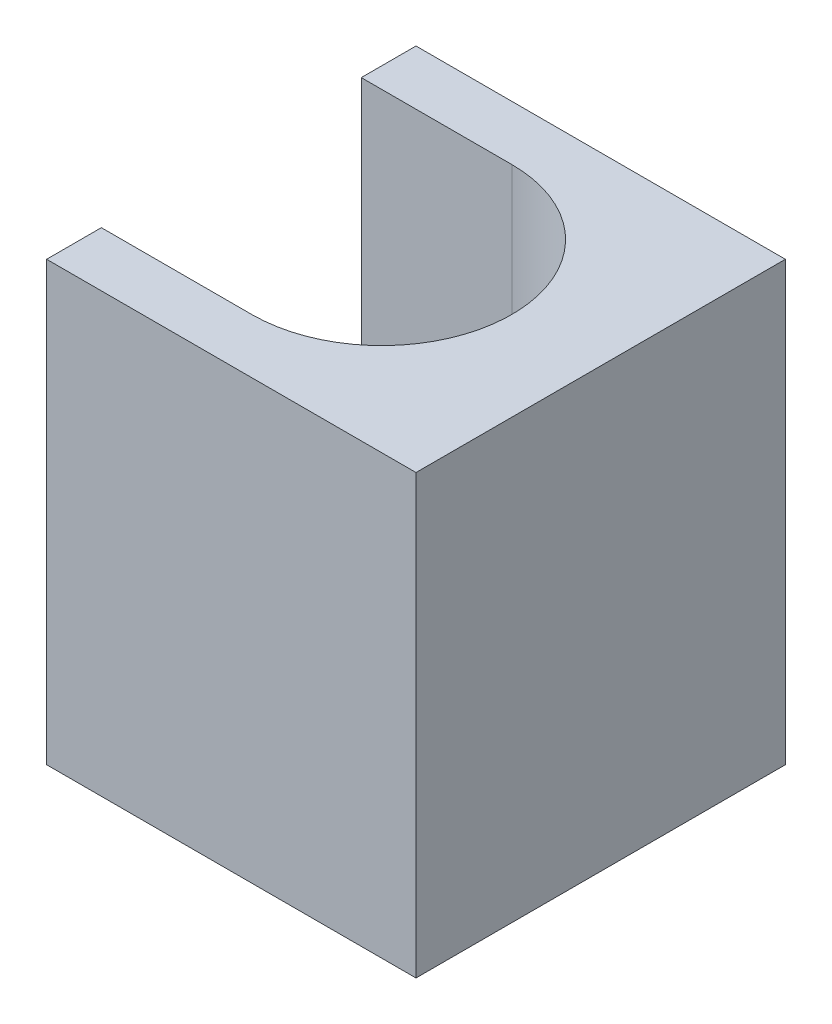
ISO-10303-21;
HEADER;
FILE_DESCRIPTION(('STEP AP214'),'2;1');
FILE_NAME('part.step','',(''),(''),'','','');
FILE_SCHEMA(('AUTOMOTIVE_DESIGN { 1 0 10303 214 1 1 1 1 }'));
ENDSEC;
DATA;
#1=APPLICATION_CONTEXT('core data for automotive mechanical design processes');
#2=APPLICATION_PROTOCOL_DEFINITION('international standard','automotive_design',2000,#1);
#3=PRODUCT_CONTEXT('',#1,'mechanical');
#4=PRODUCT('Part','Part','',(#3));
#5=PRODUCT_RELATED_PRODUCT_CATEGORY('part','',(#4));
#6=PRODUCT_DEFINITION_FORMATION('','',#4);
#7=PRODUCT_DEFINITION_CONTEXT('part definition',#1,'design');
#8=PRODUCT_DEFINITION('design','',#6,#7);
#9=PRODUCT_DEFINITION_SHAPE('','',#8);
#10=(LENGTH_UNIT() NAMED_UNIT(*) SI_UNIT(.MILLI.,.METRE.));
#11=(NAMED_UNIT(*) PLANE_ANGLE_UNIT() SI_UNIT($,.RADIAN.));
#12=(NAMED_UNIT(*) SI_UNIT($,.STERADIAN.) SOLID_ANGLE_UNIT());
#13=UNCERTAINTY_MEASURE_WITH_UNIT(LENGTH_MEASURE(1.E-05),#10,'distance_accuracy_value','');
#14=(GEOMETRIC_REPRESENTATION_CONTEXT(3) GLOBAL_UNCERTAINTY_ASSIGNED_CONTEXT((#13)) GLOBAL_UNIT_ASSIGNED_CONTEXT((#10,
#11,#12)) REPRESENTATION_CONTEXT('',''));
#15=CARTESIAN_POINT('',(0.,0.,0.));
#16=DIRECTION('',(0.,0.,1.));
#17=DIRECTION('',(1.,0.,0.));
#18=AXIS2_PLACEMENT_3D('',#15,#16,#17);
#19=CARTESIAN_POINT('',(5.5,16.,-4.75));
#20=DIRECTION('',(0.,-1.,0.));
#21=DIRECTION('',(0.,0.,-1.));
#22=AXIS2_PLACEMENT_3D('',#19,#20,#21);
#23=CYLINDRICAL_SURFACE('',#22,3.5);
#24=CARTESIAN_POINT('',(5.5,0.,-4.75));
#25=DIRECTION('',(0.,1.,0.));
#26=DIRECTION('',(0.,0.,1.));
#27=AXIS2_PLACEMENT_3D('',#24,#25,#26);
#28=CIRCLE('',#27,3.5);
#29=CARTESIAN_POINT('',(5.5,0.,-1.25));
#30=VERTEX_POINT('',#29);
#31=EDGE_CURVE('E194',#30,#30,#28,.T.);
#32=ORIENTED_EDGE('',*,*,#31,.F.);
#33=EDGE_LOOP('',(#32));
#34=FACE_BOUND('',#33,.T.);
#35=CARTESIAN_POINT('',(5.5,2.,-4.75));
#36=DIRECTION('',(0.,1.,0.));
#37=DIRECTION('',(0.,0.,1.));
#38=AXIS2_PLACEMENT_3D('',#35,#36,#37);
#39=CIRCLE('',#38,3.5);
#40=CARTESIAN_POINT('',(5.5,2.,-1.25));
#41=VERTEX_POINT('',#40);
#42=EDGE_CURVE('E140',#41,#41,#39,.T.);
#43=ORIENTED_EDGE('',*,*,#42,.T.);
#44=EDGE_LOOP('',(#43));
#45=FACE_BOUND('',#44,.T.);
#46=ADVANCED_FACE('F35',(#34,#45),#23,.F.);
#47=CARTESIAN_POINT('',(0.,16.,0.));
#48=DIRECTION('',(-1.,0.,0.));
#49=DIRECTION('',(0.,0.,1.));
#50=AXIS2_PLACEMENT_3D('',#47,#48,#49);
#51=PLANE('',#50);
#52=DIRECTION('',(0.,-1.,0.));
#53=VECTOR('',#52,1.);
#54=CARTESIAN_POINT('',(0.,6.,-9.5));
#55=LINE('',#54,#53);
#56=CARTESIAN_POINT('',(0.,16.,-9.5));
#57=VERTEX_POINT('',#56);
#58=CARTESIAN_POINT('',(0.,2.,-9.5));
#59=VERTEX_POINT('',#58);
#60=EDGE_CURVE('E162',#57,#59,#55,.T.);
#61=ORIENTED_EDGE('',*,*,#60,.F.);
#62=DIRECTION('',(0.,0.,-1.));
#63=VECTOR('',#62,1.);
#64=CARTESIAN_POINT('',(0.,16.,0.));
#65=LINE('',#64,#63);
#66=CARTESIAN_POINT('',(0.,16.,-11.5));
#67=VERTEX_POINT('',#66);
#68=EDGE_CURVE('E133',#57,#67,#65,.T.);
#69=ORIENTED_EDGE('',*,*,#68,.T.);
#70=DIRECTION('',(0.,-1.,0.));
#71=VECTOR('',#70,1.);
#72=CARTESIAN_POINT('',(0.,16.,-11.5));
#73=LINE('',#72,#71);
#74=CARTESIAN_POINT('',(0.,0.,-11.5));
#75=VERTEX_POINT('',#74);
#76=EDGE_CURVE('E182',#67,#75,#73,.T.);
#77=ORIENTED_EDGE('',*,*,#76,.T.);
#78=DIRECTION('',(0.,0.,-1.));
#79=VECTOR('',#78,1.);
#80=CARTESIAN_POINT('',(0.,0.,0.));
#81=LINE('',#80,#79);
#82=CARTESIAN_POINT('',(0.,0.,2.));
#83=VERTEX_POINT('',#82);
#84=EDGE_CURVE('E169',#83,#75,#81,.T.);
#85=ORIENTED_EDGE('',*,*,#84,.F.);
#86=DIRECTION('',(0.,-1.,0.));
#87=VECTOR('',#86,1.);
#88=CARTESIAN_POINT('',(0.,16.,2.));
#89=LINE('',#88,#87);
#90=CARTESIAN_POINT('',(0.,16.,2.));
#91=VERTEX_POINT('',#90);
#92=EDGE_CURVE('E11',#91,#83,#89,.T.);
#93=ORIENTED_EDGE('',*,*,#92,.F.);
#94=CARTESIAN_POINT('',(0.,16.,0.));
#95=VERTEX_POINT('',#94);
#96=EDGE_CURVE('E170',#91,#95,#65,.T.);
#97=ORIENTED_EDGE('',*,*,#96,.T.);
#98=DIRECTION('',(0.,-1.,0.));
#99=VECTOR('',#98,1.);
#100=CARTESIAN_POINT('',(0.,6.,0.));
#101=LINE('',#100,#99);
#102=CARTESIAN_POINT('',(0.,2.,0.));
#103=VERTEX_POINT('',#102);
#104=EDGE_CURVE('E149',#95,#103,#101,.T.);
#105=ORIENTED_EDGE('',*,*,#104,.T.);
#106=DIRECTION('',(0.,0.,-1.));
#107=VECTOR('',#106,1.);
#108=CARTESIAN_POINT('',(0.,2.,0.));
#109=LINE('',#108,#107);
#110=EDGE_CURVE('E145',#103,#59,#109,.T.);
#111=ORIENTED_EDGE('',*,*,#110,.T.);
#112=EDGE_LOOP('',(#61,#69,#77,#85,#93,#97,#105,#111));
#113=FACE_BOUND('',#112,.T.);
#114=ADVANCED_FACE('F37',(#113),#51,.T.);
#115=CARTESIAN_POINT('',(0.,16.,2.));
#116=DIRECTION('',(0.,0.,1.));
#117=DIRECTION('',(1.,0.,0.));
#118=AXIS2_PLACEMENT_3D('',#115,#116,#117);
#119=PLANE('',#118);
#120=DIRECTION('',(-1.,0.,0.));
#121=VECTOR('',#120,1.);
#122=CARTESIAN_POINT('',(0.,0.,2.));
#123=LINE('',#122,#121);
#124=CARTESIAN_POINT('',(13.5,0.,2.));
#125=VERTEX_POINT('',#124);
#126=EDGE_CURVE('E185',#125,#83,#123,.T.);
#127=ORIENTED_EDGE('',*,*,#126,.F.);
#128=DIRECTION('',(0.,-1.,0.));
#129=VECTOR('',#128,1.);
#130=CARTESIAN_POINT('',(13.5,16.,2.));
#131=LINE('',#130,#129);
#132=CARTESIAN_POINT('',(13.5,16.,2.));
#133=VERTEX_POINT('',#132);
#134=EDGE_CURVE('E43',#133,#125,#131,.T.);
#135=ORIENTED_EDGE('',*,*,#134,.F.);
#136=DIRECTION('',(-1.,0.,0.));
#137=VECTOR('',#136,1.);
#138=CARTESIAN_POINT('',(0.,16.,2.));
#139=LINE('',#138,#137);
#140=EDGE_CURVE('E173',#133,#91,#139,.T.);
#141=ORIENTED_EDGE('',*,*,#140,.T.);
#142=ORIENTED_EDGE('',*,*,#92,.T.);
#143=EDGE_LOOP('',(#127,#135,#141,#142));
#144=FACE_BOUND('',#143,.T.);
#145=ADVANCED_FACE('F206',(#144),#119,.T.);
#146=CARTESIAN_POINT('',(13.5,16.,0.));
#147=DIRECTION('',(1.,0.,0.));
#148=DIRECTION('',(0.,0.,-1.));
#149=AXIS2_PLACEMENT_3D('',#146,#147,#148);
#150=PLANE('',#149);
#151=DIRECTION('',(0.,0.,1.));
#152=VECTOR('',#151,1.);
#153=CARTESIAN_POINT('',(13.5,0.,0.));
#154=LINE('',#153,#152);
#155=CARTESIAN_POINT('',(13.5,0.,-11.5));
#156=VERTEX_POINT('',#155);
#157=EDGE_CURVE('E188',#156,#125,#154,.T.);
#158=ORIENTED_EDGE('',*,*,#157,.F.);
#159=DIRECTION('',(0.,-1.,0.));
#160=VECTOR('',#159,1.);
#161=CARTESIAN_POINT('',(13.5,16.,-11.5));
#162=LINE('',#161,#160);
#163=CARTESIAN_POINT('',(13.5,16.,-11.5));
#164=VERTEX_POINT('',#163);
#165=EDGE_CURVE('E198',#164,#156,#162,.T.);
#166=ORIENTED_EDGE('',*,*,#165,.F.);
#167=DIRECTION('',(0.,0.,1.));
#168=VECTOR('',#167,1.);
#169=CARTESIAN_POINT('',(13.5,16.,0.));
#170=LINE('',#169,#168);
#171=EDGE_CURVE('E176',#164,#133,#170,.T.);
#172=ORIENTED_EDGE('',*,*,#171,.T.);
#173=ORIENTED_EDGE('',*,*,#134,.T.);
#174=EDGE_LOOP('',(#158,#166,#172,#173));
#175=FACE_BOUND('',#174,.T.);
#176=ADVANCED_FACE('F202',(#175),#150,.T.);
#177=CARTESIAN_POINT('',(0.,16.,-11.5));
#178=DIRECTION('',(0.,0.,-1.));
#179=DIRECTION('',(-1.,0.,0.));
#180=AXIS2_PLACEMENT_3D('',#177,#178,#179);
#181=PLANE('',#180);
#182=DIRECTION('',(1.,0.,0.));
#183=VECTOR('',#182,1.);
#184=CARTESIAN_POINT('',(0.,0.,-11.5));
#185=LINE('',#184,#183);
#186=EDGE_CURVE('E191',#75,#156,#185,.T.);
#187=ORIENTED_EDGE('',*,*,#186,.F.);
#188=ORIENTED_EDGE('',*,*,#76,.F.);
#189=DIRECTION('',(1.,0.,0.));
#190=VECTOR('',#189,1.);
#191=CARTESIAN_POINT('',(0.,16.,-11.5));
#192=LINE('',#191,#190);
#193=EDGE_CURVE('E179',#67,#164,#192,.T.);
#194=ORIENTED_EDGE('',*,*,#193,.T.);
#195=ORIENTED_EDGE('',*,*,#165,.T.);
#196=EDGE_LOOP('',(#187,#188,#194,#195));
#197=FACE_BOUND('',#196,.T.);
#198=ADVANCED_FACE('F214',(#197),#181,.T.);
#199=CARTESIAN_POINT('',(0.,16.,0.));
#200=DIRECTION('',(0.,1.,0.));
#201=DIRECTION('',(0.,0.,1.));
#202=AXIS2_PLACEMENT_3D('',#199,#200,#201);
#203=PLANE('',#202);
#204=DIRECTION('',(1.,0.,0.));
#205=VECTOR('',#204,1.);
#206=CARTESIAN_POINT('',(0.,16.,-9.5));
#207=LINE('',#206,#205);
#208=CARTESIAN_POINT('',(5.5,16.,-9.5));
#209=VERTEX_POINT('',#208);
#210=EDGE_CURVE('E117',#57,#209,#207,.T.);
#211=ORIENTED_EDGE('',*,*,#210,.T.);
#212=CARTESIAN_POINT('',(5.5,16.,-4.75));
#213=DIRECTION('',(0.,1.,0.));
#214=DIRECTION('',(0.,0.,1.));
#215=AXIS2_PLACEMENT_3D('',#212,#213,#214);
#216=CIRCLE('',#215,4.75);
#217=CARTESIAN_POINT('',(5.5,16.,0.));
#218=VERTEX_POINT('',#217);
#219=EDGE_CURVE('E126',#209,#218,#216,.F.);
#220=ORIENTED_EDGE('',*,*,#219,.T.);
#221=DIRECTION('',(-1.,0.,0.));
#222=VECTOR('',#221,1.);
#223=CARTESIAN_POINT('',(0.,16.,0.));
#224=LINE('',#223,#222);
#225=EDGE_CURVE('E134',#218,#95,#224,.T.);
#226=ORIENTED_EDGE('',*,*,#225,.T.);
#227=ORIENTED_EDGE('',*,*,#96,.F.);
#228=ORIENTED_EDGE('',*,*,#140,.F.);
#229=ORIENTED_EDGE('',*,*,#171,.F.);
#230=ORIENTED_EDGE('',*,*,#193,.F.);
#231=ORIENTED_EDGE('',*,*,#68,.F.);
#232=EDGE_LOOP('',(#211,#220,#226,#227,#228,#229,#230,#231));
#233=FACE_BOUND('',#232,.T.);
#234=ADVANCED_FACE('F131',(#233),#203,.T.);
#235=CARTESIAN_POINT('',(0.,0.,0.));
#236=DIRECTION('',(0.,1.,0.));
#237=DIRECTION('',(0.,0.,1.));
#238=AXIS2_PLACEMENT_3D('',#235,#236,#237);
#239=PLANE('',#238);
#240=ORIENTED_EDGE('',*,*,#84,.T.);
#241=ORIENTED_EDGE('',*,*,#186,.T.);
#242=ORIENTED_EDGE('',*,*,#157,.T.);
#243=ORIENTED_EDGE('',*,*,#126,.T.);
#244=EDGE_LOOP('',(#240,#241,#242,#243));
#245=FACE_BOUND('',#244,.T.);
#246=ORIENTED_EDGE('',*,*,#31,.T.);
#247=EDGE_LOOP('',(#246));
#248=FACE_BOUND('',#247,.T.);
#249=ADVANCED_FACE('F209',(#245,#248),#239,.F.);
#250=CARTESIAN_POINT('',(0.,6.,0.));
#251=DIRECTION('',(0.,0.,1.));
#252=DIRECTION('',(1.,0.,0.));
#253=AXIS2_PLACEMENT_3D('',#250,#251,#252);
#254=PLANE('',#253);
#255=ORIENTED_EDGE('',*,*,#104,.F.);
#256=ORIENTED_EDGE('',*,*,#225,.F.);
#257=DIRECTION('',(0.,-1.,0.));
#258=VECTOR('',#257,1.);
#259=CARTESIAN_POINT('',(5.5,16.,0.));
#260=LINE('',#259,#258);
#261=CARTESIAN_POINT('',(5.5,6.,0.));
#262=VERTEX_POINT('',#261);
#263=EDGE_CURVE('E50',#218,#262,#260,.T.);
#264=ORIENTED_EDGE('',*,*,#263,.T.);
#265=DIRECTION('',(-1.,0.,0.));
#266=VECTOR('',#265,1.);
#267=CARTESIAN_POINT('',(0.,6.,0.));
#268=LINE('',#267,#266);
#269=CARTESIAN_POINT('',(11.5,6.,0.));
#270=VERTEX_POINT('',#269);
#271=EDGE_CURVE('E141',#270,#262,#268,.T.);
#272=ORIENTED_EDGE('',*,*,#271,.F.);
#273=DIRECTION('',(0.,-1.,0.));
#274=VECTOR('',#273,1.);
#275=CARTESIAN_POINT('',(11.5,6.,0.));
#276=LINE('',#275,#274);
#277=CARTESIAN_POINT('',(11.5,2.,0.));
#278=VERTEX_POINT('',#277);
#279=EDGE_CURVE('E167',#270,#278,#276,.T.);
#280=ORIENTED_EDGE('',*,*,#279,.T.);
#281=DIRECTION('',(-1.,0.,0.));
#282=VECTOR('',#281,1.);
#283=CARTESIAN_POINT('',(0.,2.,0.));
#284=LINE('',#283,#282);
#285=EDGE_CURVE('E152',#278,#103,#284,.T.);
#286=ORIENTED_EDGE('',*,*,#285,.T.);
#287=EDGE_LOOP('',(#255,#256,#264,#272,#280,#286));
#288=FACE_BOUND('',#287,.T.);
#289=ADVANCED_FACE('F223',(#288),#254,.F.);
#290=CARTESIAN_POINT('',(11.5,6.,0.));
#291=DIRECTION('',(1.,0.,0.));
#292=DIRECTION('',(0.,0.,-1.));
#293=AXIS2_PLACEMENT_3D('',#290,#291,#292);
#294=PLANE('',#293);
#295=DIRECTION('',(0.,0.,1.));
#296=VECTOR('',#295,1.);
#297=CARTESIAN_POINT('',(11.5,2.,0.));
#298=LINE('',#297,#296);
#299=CARTESIAN_POINT('',(11.5,2.,-9.5));
#300=VERTEX_POINT('',#299);
#301=EDGE_CURVE('E154',#300,#278,#298,.T.);
#302=ORIENTED_EDGE('',*,*,#301,.T.);
#303=ORIENTED_EDGE('',*,*,#279,.F.);
#304=DIRECTION('',(0.,0.,1.));
#305=VECTOR('',#304,1.);
#306=CARTESIAN_POINT('',(11.5,6.,0.));
#307=LINE('',#306,#305);
#308=CARTESIAN_POINT('',(11.5,6.,-9.5));
#309=VERTEX_POINT('',#308);
#310=EDGE_CURVE('E144',#309,#270,#307,.T.);
#311=ORIENTED_EDGE('',*,*,#310,.F.);
#312=DIRECTION('',(0.,-1.,0.));
#313=VECTOR('',#312,1.);
#314=CARTESIAN_POINT('',(11.5,6.,-9.5));
#315=LINE('',#314,#313);
#316=EDGE_CURVE('E164',#309,#300,#315,.T.);
#317=ORIENTED_EDGE('',*,*,#316,.T.);
#318=EDGE_LOOP('',(#302,#303,#311,#317));
#319=FACE_BOUND('',#318,.T.);
#320=ADVANCED_FACE('F219',(#319),#294,.F.);
#321=CARTESIAN_POINT('',(0.,6.,-9.5));
#322=DIRECTION('',(0.,0.,-1.));
#323=DIRECTION('',(-1.,0.,0.));
#324=AXIS2_PLACEMENT_3D('',#321,#322,#323);
#325=PLANE('',#324);
#326=DIRECTION('',(1.,0.,0.));
#327=VECTOR('',#326,1.);
#328=CARTESIAN_POINT('',(0.,6.,-9.5));
#329=LINE('',#328,#327);
#330=CARTESIAN_POINT('',(5.5,6.,-9.5));
#331=VERTEX_POINT('',#330);
#332=EDGE_CURVE('E120',#331,#309,#329,.T.);
#333=ORIENTED_EDGE('',*,*,#332,.F.);
#334=DIRECTION('',(0.,-1.,0.));
#335=VECTOR('',#334,1.);
#336=CARTESIAN_POINT('',(5.5,16.,-9.5));
#337=LINE('',#336,#335);
#338=EDGE_CURVE('E113',#209,#331,#337,.T.);
#339=ORIENTED_EDGE('',*,*,#338,.F.);
#340=ORIENTED_EDGE('',*,*,#210,.F.);
#341=ORIENTED_EDGE('',*,*,#60,.T.);
#342=DIRECTION('',(1.,0.,0.));
#343=VECTOR('',#342,1.);
#344=CARTESIAN_POINT('',(0.,2.,-9.5));
#345=LINE('',#344,#343);
#346=EDGE_CURVE('E58',#59,#300,#345,.T.);
#347=ORIENTED_EDGE('',*,*,#346,.T.);
#348=ORIENTED_EDGE('',*,*,#316,.F.);
#349=EDGE_LOOP('',(#333,#339,#340,#341,#347,#348));
#350=FACE_BOUND('',#349,.T.);
#351=ADVANCED_FACE('F115',(#350),#325,.F.);
#352=CARTESIAN_POINT('',(0.,6.,0.));
#353=DIRECTION('',(0.,1.,0.));
#354=DIRECTION('',(0.,0.,1.));
#355=AXIS2_PLACEMENT_3D('',#352,#353,#354);
#356=PLANE('',#355);
#357=ORIENTED_EDGE('',*,*,#271,.T.);
#358=CARTESIAN_POINT('',(5.5,6.,-4.75));
#359=DIRECTION('',(0.,1.,0.));
#360=DIRECTION('',(0.,0.,1.));
#361=AXIS2_PLACEMENT_3D('',#358,#359,#360);
#362=CIRCLE('',#361,4.75);
#363=EDGE_CURVE('E123',#262,#331,#362,.T.);
#364=ORIENTED_EDGE('',*,*,#363,.T.);
#365=ORIENTED_EDGE('',*,*,#332,.T.);
#366=ORIENTED_EDGE('',*,*,#310,.T.);
#367=EDGE_LOOP('',(#357,#364,#365,#366));
#368=FACE_BOUND('',#367,.T.);
#369=ADVANCED_FACE('F225',(#368),#356,.F.);
#370=CARTESIAN_POINT('',(0.,2.,0.));
#371=DIRECTION('',(0.,1.,0.));
#372=DIRECTION('',(0.,0.,1.));
#373=AXIS2_PLACEMENT_3D('',#370,#371,#372);
#374=PLANE('',#373);
#375=ORIENTED_EDGE('',*,*,#301,.F.);
#376=ORIENTED_EDGE('',*,*,#346,.F.);
#377=ORIENTED_EDGE('',*,*,#110,.F.);
#378=ORIENTED_EDGE('',*,*,#285,.F.);
#379=EDGE_LOOP('',(#375,#376,#377,#378));
#380=FACE_BOUND('',#379,.T.);
#381=ORIENTED_EDGE('',*,*,#42,.F.);
#382=EDGE_LOOP('',(#381));
#383=FACE_BOUND('',#382,.T.);
#384=ADVANCED_FACE('F221',(#380,#383),#374,.T.);
#385=CARTESIAN_POINT('',(5.5,16.,-4.75));
#386=DIRECTION('',(0.,-1.,0.));
#387=DIRECTION('',(0.,0.,-1.));
#388=AXIS2_PLACEMENT_3D('',#385,#386,#387);
#389=CYLINDRICAL_SURFACE('',#388,4.75);
#390=ORIENTED_EDGE('',*,*,#263,.F.);
#391=ORIENTED_EDGE('',*,*,#219,.F.);
#392=ORIENTED_EDGE('',*,*,#338,.T.);
#393=ORIENTED_EDGE('',*,*,#363,.F.);
#394=EDGE_LOOP('',(#390,#391,#392,#393));
#395=FACE_BOUND('',#394,.T.);
#396=ADVANCED_FACE('F127',(#395),#389,.F.);
#397=CLOSED_SHELL('',(#46,#114,#145,#176,#198,#234,#249,#289,#320,#351,#369,#384,#396));
#398=MANIFOLD_SOLID_BREP('B2',#397);
#399=ADVANCED_BREP_SHAPE_REPRESENTATION('',(#18,#398),#14);
#400=SHAPE_DEFINITION_REPRESENTATION(#9,#399);
ENDSEC;
END-ISO-10303-21;
